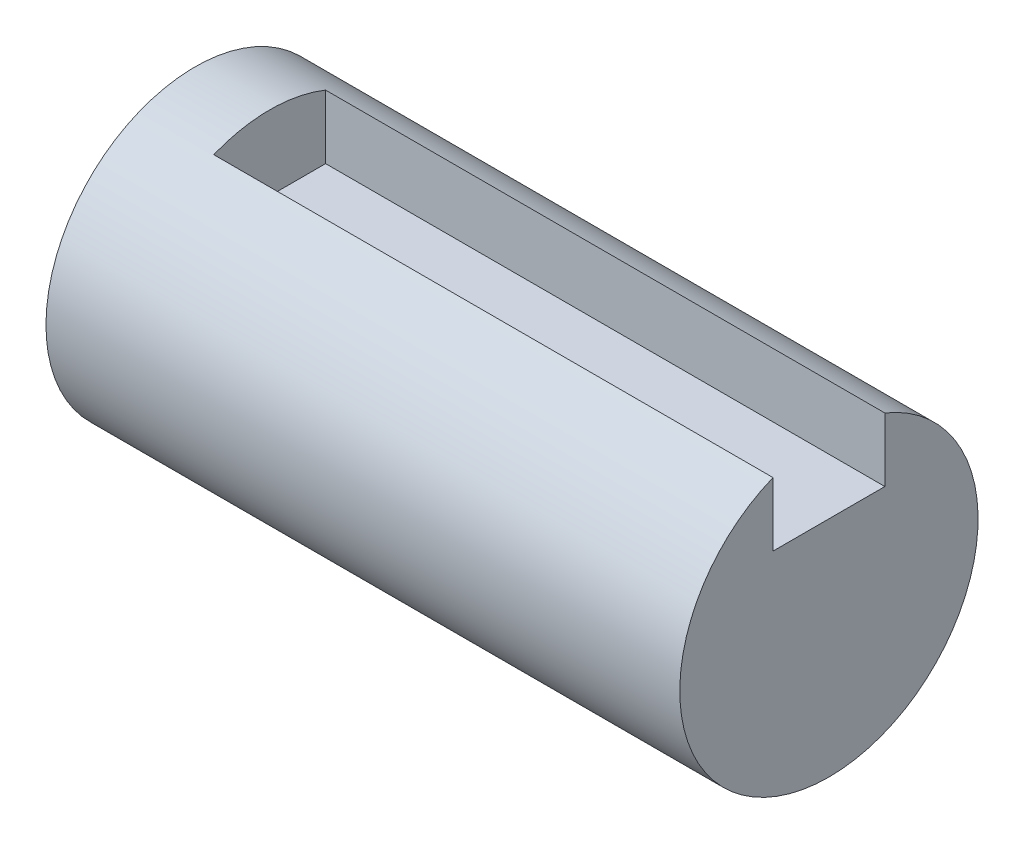
ISO-10303-21;
HEADER;
FILE_DESCRIPTION(('STEP AP214'),'2;1');
FILE_NAME('part.step','',(''),(''),'','','');
FILE_SCHEMA(('AUTOMOTIVE_DESIGN { 1 0 10303 214 1 1 1 1 }'));
ENDSEC;
DATA;
#1=APPLICATION_CONTEXT('core data for automotive mechanical design processes');
#2=APPLICATION_PROTOCOL_DEFINITION('international standard','automotive_design',2000,#1);
#3=PRODUCT_CONTEXT('',#1,'mechanical');
#4=PRODUCT('Part','Part','',(#3));
#5=PRODUCT_RELATED_PRODUCT_CATEGORY('part','',(#4));
#6=PRODUCT_DEFINITION_FORMATION('','',#4);
#7=PRODUCT_DEFINITION_CONTEXT('part definition',#1,'design');
#8=PRODUCT_DEFINITION('design','',#6,#7);
#9=PRODUCT_DEFINITION_SHAPE('','',#8);
#10=(LENGTH_UNIT() NAMED_UNIT(*) SI_UNIT(.MILLI.,.METRE.));
#11=(NAMED_UNIT(*) PLANE_ANGLE_UNIT() SI_UNIT($,.RADIAN.));
#12=(NAMED_UNIT(*) SI_UNIT($,.STERADIAN.) SOLID_ANGLE_UNIT());
#13=UNCERTAINTY_MEASURE_WITH_UNIT(LENGTH_MEASURE(1.E-05),#10,'distance_accuracy_value','');
#14=(GEOMETRIC_REPRESENTATION_CONTEXT(3) GLOBAL_UNCERTAINTY_ASSIGNED_CONTEXT((#13)) GLOBAL_UNIT_ASSIGNED_CONTEXT((#10,
#11,#12)) REPRESENTATION_CONTEXT('',''));
#15=CARTESIAN_POINT('',(0.,0.,0.));
#16=DIRECTION('',(0.,0.,1.));
#17=DIRECTION('',(1.,0.,0.));
#18=AXIS2_PLACEMENT_3D('',#15,#16,#17);
#19=CARTESIAN_POINT('',(17.,0.,0.));
#20=DIRECTION('',(-1.,0.,0.));
#21=DIRECTION('',(0.,0.,1.));
#22=AXIS2_PLACEMENT_3D('',#19,#20,#21);
#23=CYLINDRICAL_SURFACE('',#22,4.);
#24=CARTESIAN_POINT('',(0.,0.,0.));
#25=DIRECTION('',(1.,0.,0.));
#26=DIRECTION('',(0.,0.,-1.));
#27=AXIS2_PLACEMENT_3D('',#24,#25,#26);
#28=CIRCLE('',#27,4.);
#29=CARTESIAN_POINT('',(0.,0.,-4.));
#30=VERTEX_POINT('',#29);
#31=EDGE_CURVE('E41',#30,#30,#28,.T.);
#32=ORIENTED_EDGE('',*,*,#31,.T.);
#33=EDGE_LOOP('',(#32));
#34=FACE_BOUND('',#33,.T.);
#35=DIRECTION('',(1.,0.,0.));
#36=VECTOR('',#35,1.);
#37=CARTESIAN_POINT('',(2.,3.70809924354783,1.5));
#38=LINE('',#37,#36);
#39=CARTESIAN_POINT('',(2.,3.70809924354783,1.5));
#40=VERTEX_POINT('',#39);
#41=CARTESIAN_POINT('',(17.,3.70809924354783,1.5));
#42=VERTEX_POINT('',#41);
#43=EDGE_CURVE('E90',#40,#42,#38,.T.);
#44=ORIENTED_EDGE('',*,*,#43,.F.);
#45=CARTESIAN_POINT('',(2.,0.,0.));
#46=DIRECTION('',(1.,0.,0.));
#47=DIRECTION('',(0.,0.,-1.));
#48=AXIS2_PLACEMENT_3D('',#45,#46,#47);
#49=CIRCLE('',#48,4.);
#50=CARTESIAN_POINT('',(2.,3.70809924354783,-1.5));
#51=VERTEX_POINT('',#50);
#52=EDGE_CURVE('E95',#51,#40,#49,.T.);
#53=ORIENTED_EDGE('',*,*,#52,.F.);
#54=DIRECTION('',(1.,0.,0.));
#55=VECTOR('',#54,1.);
#56=CARTESIAN_POINT('',(2.,3.70809924354783,-1.5));
#57=LINE('',#56,#55);
#58=CARTESIAN_POINT('',(17.,3.70809924354783,-1.5));
#59=VERTEX_POINT('',#58);
#60=EDGE_CURVE('E80',#51,#59,#57,.T.);
#61=ORIENTED_EDGE('',*,*,#60,.T.);
#62=CARTESIAN_POINT('',(17.,0.,0.));
#63=DIRECTION('',(1.,0.,0.));
#64=DIRECTION('',(0.,0.,-1.));
#65=AXIS2_PLACEMENT_3D('',#62,#63,#64);
#66=CIRCLE('',#65,4.);
#67=EDGE_CURVE('E11',#42,#59,#66,.T.);
#68=ORIENTED_EDGE('',*,*,#67,.F.);
#69=EDGE_LOOP('',(#44,#53,#61,#68));
#70=FACE_BOUND('',#69,.T.);
#71=ADVANCED_FACE('F38',(#34,#70),#23,.T.);
#72=CARTESIAN_POINT('',(17.,0.,0.));
#73=DIRECTION('',(1.,0.,0.));
#74=DIRECTION('',(0.,0.,-1.));
#75=AXIS2_PLACEMENT_3D('',#72,#73,#74);
#76=PLANE('',#75);
#77=DIRECTION('',(0.,0.,-1.));
#78=VECTOR('',#77,1.);
#79=CARTESIAN_POINT('',(17.,2.,0.));
#80=LINE('',#79,#78);
#81=CARTESIAN_POINT('',(17.,2.,1.5));
#82=VERTEX_POINT('',#81);
#83=CARTESIAN_POINT('',(17.,2.,-1.5));
#84=VERTEX_POINT('',#83);
#85=EDGE_CURVE('E52',#82,#84,#80,.T.);
#86=ORIENTED_EDGE('',*,*,#85,.F.);
#87=DIRECTION('',(0.,1.,0.));
#88=VECTOR('',#87,1.);
#89=CARTESIAN_POINT('',(17.,0.,1.5));
#90=LINE('',#89,#88);
#91=EDGE_CURVE('E106',#82,#42,#90,.T.);
#92=ORIENTED_EDGE('',*,*,#91,.T.);
#93=ORIENTED_EDGE('',*,*,#67,.T.);
#94=DIRECTION('',(0.,1.,0.));
#95=VECTOR('',#94,1.);
#96=CARTESIAN_POINT('',(17.,0.,-1.5));
#97=LINE('',#96,#95);
#98=EDGE_CURVE('E86',#84,#59,#97,.T.);
#99=ORIENTED_EDGE('',*,*,#98,.F.);
#100=EDGE_LOOP('',(#86,#92,#93,#99));
#101=FACE_BOUND('',#100,.T.);
#102=ADVANCED_FACE('F112',(#101),#76,.T.);
#103=CARTESIAN_POINT('',(0.,0.,0.));
#104=DIRECTION('',(1.,0.,0.));
#105=DIRECTION('',(0.,0.,-1.));
#106=AXIS2_PLACEMENT_3D('',#103,#104,#105);
#107=PLANE('',#106);
#108=ORIENTED_EDGE('',*,*,#31,.F.);
#109=EDGE_LOOP('',(#108));
#110=FACE_BOUND('',#109,.T.);
#111=ADVANCED_FACE('F116',(#110),#107,.F.);
#112=CARTESIAN_POINT('',(2.,2.,0.));
#113=DIRECTION('',(0.,-1.,0.));
#114=DIRECTION('',(0.,0.,-1.));
#115=AXIS2_PLACEMENT_3D('',#112,#113,#114);
#116=PLANE('',#115);
#117=ORIENTED_EDGE('',*,*,#85,.T.);
#118=DIRECTION('',(1.,0.,0.));
#119=VECTOR('',#118,1.);
#120=CARTESIAN_POINT('',(2.,2.,-1.5));
#121=LINE('',#120,#119);
#122=CARTESIAN_POINT('',(2.,2.,-1.5));
#123=VERTEX_POINT('',#122);
#124=EDGE_CURVE('E75',#123,#84,#121,.T.);
#125=ORIENTED_EDGE('',*,*,#124,.F.);
#126=DIRECTION('',(0.,0.,-1.));
#127=VECTOR('',#126,1.);
#128=CARTESIAN_POINT('',(2.,2.,0.));
#129=LINE('',#128,#127);
#130=CARTESIAN_POINT('',(2.,2.,1.5));
#131=VERTEX_POINT('',#130);
#132=EDGE_CURVE('E97',#131,#123,#129,.T.);
#133=ORIENTED_EDGE('',*,*,#132,.F.);
#134=DIRECTION('',(1.,0.,0.));
#135=VECTOR('',#134,1.);
#136=CARTESIAN_POINT('',(2.,2.,1.5));
#137=LINE('',#136,#135);
#138=EDGE_CURVE('E60',#131,#82,#137,.T.);
#139=ORIENTED_EDGE('',*,*,#138,.T.);
#140=EDGE_LOOP('',(#117,#125,#133,#139));
#141=FACE_BOUND('',#140,.T.);
#142=ADVANCED_FACE('F114',(#141),#116,.F.);
#143=CARTESIAN_POINT('',(2.,0.,1.5));
#144=DIRECTION('',(0.,0.,-1.));
#145=DIRECTION('',(-1.,0.,0.));
#146=AXIS2_PLACEMENT_3D('',#143,#144,#145);
#147=PLANE('',#146);
#148=ORIENTED_EDGE('',*,*,#91,.F.);
#149=ORIENTED_EDGE('',*,*,#138,.F.);
#150=DIRECTION('',(0.,1.,0.));
#151=VECTOR('',#150,1.);
#152=CARTESIAN_POINT('',(2.,0.,1.5));
#153=LINE('',#152,#151);
#154=EDGE_CURVE('E99',#131,#40,#153,.T.);
#155=ORIENTED_EDGE('',*,*,#154,.T.);
#156=ORIENTED_EDGE('',*,*,#43,.T.);
#157=EDGE_LOOP('',(#148,#149,#155,#156));
#158=FACE_BOUND('',#157,.T.);
#159=ADVANCED_FACE('F113',(#158),#147,.T.);
#160=CARTESIAN_POINT('',(2.,0.,-1.5));
#161=DIRECTION('',(0.,0.,-1.));
#162=DIRECTION('',(-1.,0.,0.));
#163=AXIS2_PLACEMENT_3D('',#160,#161,#162);
#164=PLANE('',#163);
#165=ORIENTED_EDGE('',*,*,#98,.T.);
#166=ORIENTED_EDGE('',*,*,#60,.F.);
#167=DIRECTION('',(0.,1.,0.));
#168=VECTOR('',#167,1.);
#169=CARTESIAN_POINT('',(2.,0.,-1.5));
#170=LINE('',#169,#168);
#171=EDGE_CURVE('E83',#123,#51,#170,.T.);
#172=ORIENTED_EDGE('',*,*,#171,.F.);
#173=ORIENTED_EDGE('',*,*,#124,.T.);
#174=EDGE_LOOP('',(#165,#166,#172,#173));
#175=FACE_BOUND('',#174,.T.);
#176=ADVANCED_FACE('F82',(#175),#164,.F.);
#177=CARTESIAN_POINT('',(2.,0.,0.));
#178=DIRECTION('',(1.,0.,0.));
#179=DIRECTION('',(0.,0.,-1.));
#180=AXIS2_PLACEMENT_3D('',#177,#178,#179);
#181=PLANE('',#180);
#182=ORIENTED_EDGE('',*,*,#132,.T.);
#183=ORIENTED_EDGE('',*,*,#171,.T.);
#184=ORIENTED_EDGE('',*,*,#52,.T.);
#185=ORIENTED_EDGE('',*,*,#154,.F.);
#186=EDGE_LOOP('',(#182,#183,#184,#185));
#187=FACE_BOUND('',#186,.T.);
#188=ADVANCED_FACE('F94',(#187),#181,.T.);
#189=CLOSED_SHELL('',(#71,#102,#111,#142,#159,#176,#188));
#190=MANIFOLD_SOLID_BREP('B2',#189);
#191=ADVANCED_BREP_SHAPE_REPRESENTATION('',(#18,#190),#14);
#192=SHAPE_DEFINITION_REPRESENTATION(#9,#191);
ENDSEC;
END-ISO-10303-21;
